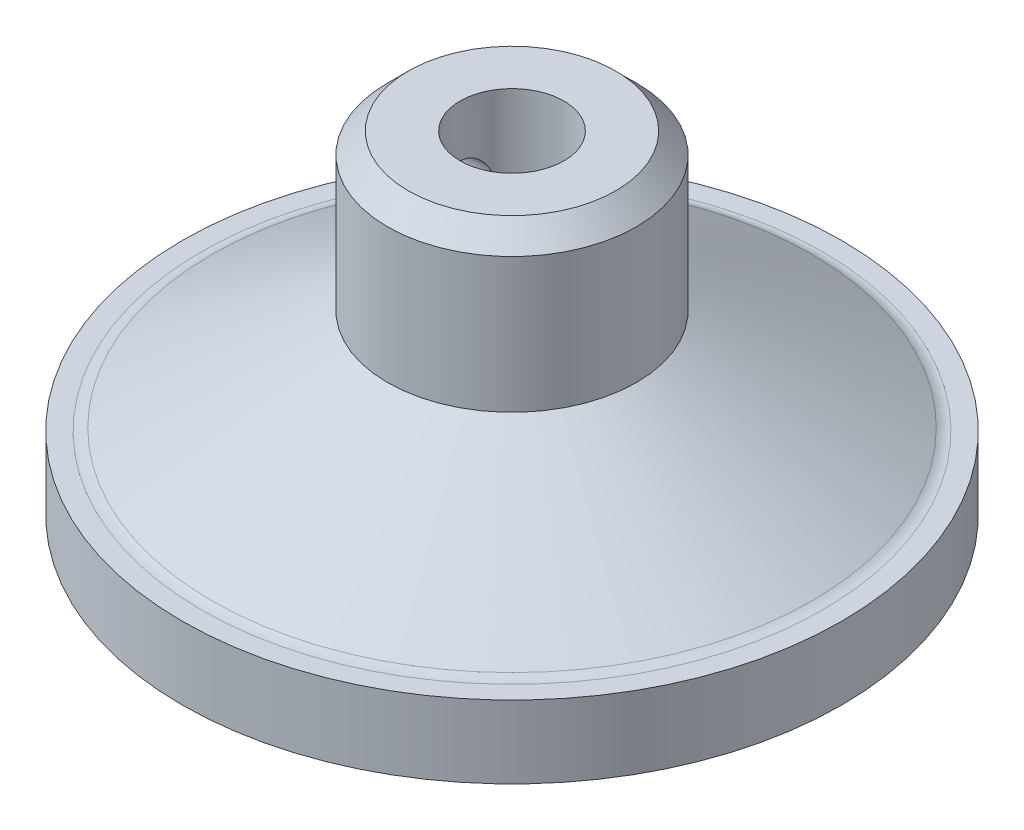
ISO-10303-21;
HEADER;
FILE_DESCRIPTION(('STEP AP214'),'2;1');
FILE_NAME('part.step','',(''),(''),'','','');
FILE_SCHEMA(('AUTOMOTIVE_DESIGN { 1 0 10303 214 1 1 1 1 }'));
ENDSEC;
DATA;
#1=APPLICATION_CONTEXT('core data for automotive mechanical design processes');
#2=APPLICATION_PROTOCOL_DEFINITION('international standard','automotive_design',2000,#1);
#3=PRODUCT_CONTEXT('',#1,'mechanical');
#4=PRODUCT('Part','Part','',(#3));
#5=PRODUCT_RELATED_PRODUCT_CATEGORY('part','',(#4));
#6=PRODUCT_DEFINITION_FORMATION('','',#4);
#7=PRODUCT_DEFINITION_CONTEXT('part definition',#1,'design');
#8=PRODUCT_DEFINITION('design','',#6,#7);
#9=PRODUCT_DEFINITION_SHAPE('','',#8);
#10=(LENGTH_UNIT() NAMED_UNIT(*) SI_UNIT(.MILLI.,.METRE.));
#11=(NAMED_UNIT(*) PLANE_ANGLE_UNIT() SI_UNIT($,.RADIAN.));
#12=(NAMED_UNIT(*) SI_UNIT($,.STERADIAN.) SOLID_ANGLE_UNIT());
#13=UNCERTAINTY_MEASURE_WITH_UNIT(LENGTH_MEASURE(1.E-05),#10,'distance_accuracy_value','');
#14=(GEOMETRIC_REPRESENTATION_CONTEXT(3) GLOBAL_UNCERTAINTY_ASSIGNED_CONTEXT((#13)) GLOBAL_UNIT_ASSIGNED_CONTEXT((#10,
#11,#12)) REPRESENTATION_CONTEXT('',''));
#15=CARTESIAN_POINT('',(0.,0.,0.));
#16=DIRECTION('',(0.,0.,1.));
#17=DIRECTION('',(1.,0.,0.));
#18=AXIS2_PLACEMENT_3D('',#15,#16,#17);
#19=CARTESIAN_POINT('',(0.,31.9758235435502,0.));
#20=DIRECTION('',(0.,1.,0.));
#21=DIRECTION('',(0.,0.,1.));
#22=AXIS2_PLACEMENT_3D('',#19,#20,#21);
#23=CYLINDRICAL_SURFACE('',#22,15.8878221735089);
#24=CARTESIAN_POINT('',(0.,-5.01591647054692,0.));
#25=DIRECTION('',(0.,1.,0.));
#26=DIRECTION('',(0.,0.,1.));
#27=AXIS2_PLACEMENT_3D('',#24,#25,#26);
#28=CIRCLE('',#27,15.8878221735089);
#29=CARTESIAN_POINT('',(0.,-5.01591647054692,15.8878221735089));
#30=VERTEX_POINT('',#29);
#31=EDGE_CURVE('E160',#30,#30,#28,.T.);
#32=ORIENTED_EDGE('',*,*,#31,.T.);
#33=EDGE_LOOP('',(#32));
#34=FACE_BOUND('',#33,.T.);
#35=CARTESIAN_POINT('',(0.,-1.51591647054691,0.));
#36=DIRECTION('',(0.,1.,0.));
#37=DIRECTION('',(0.,0.,1.));
#38=AXIS2_PLACEMENT_3D('',#35,#36,#37);
#39=CIRCLE('',#38,15.8878221735089);
#40=CARTESIAN_POINT('',(0.,-1.51591647054691,15.8878221735089));
#41=VERTEX_POINT('',#40);
#42=EDGE_CURVE('E146',#41,#41,#39,.T.);
#43=ORIENTED_EDGE('',*,*,#42,.F.);
#44=EDGE_LOOP('',(#43));
#45=FACE_BOUND('',#44,.T.);
#46=ADVANCED_FACE('F37',(#34,#45),#23,.T.);
#47=CARTESIAN_POINT('',(0.,-1.51591647054692,0.));
#48=DIRECTION('',(0.,1.,0.));
#49=DIRECTION('',(0.,0.,1.));
#50=AXIS2_PLACEMENT_3D('',#47,#48,#49);
#51=PLANE('',#50);
#52=CARTESIAN_POINT('',(0.,-1.51591647054692,0.));
#53=DIRECTION('',(0.,1.,0.));
#54=DIRECTION('',(0.,0.,1.));
#55=AXIS2_PLACEMENT_3D('',#52,#53,#54);
#56=CIRCLE('',#55,14.9557713659401);
#57=CARTESIAN_POINT('',(0.,-1.51591647054692,14.9557713659401));
#58=VERTEX_POINT('',#57);
#59=EDGE_CURVE('E49',#58,#58,#56,.F.);
#60=ORIENTED_EDGE('',*,*,#59,.T.);
#61=EDGE_LOOP('',(#60));
#62=FACE_BOUND('',#61,.T.);
#63=ORIENTED_EDGE('',*,*,#42,.T.);
#64=EDGE_LOOP('',(#63));
#65=FACE_BOUND('',#64,.T.);
#66=ADVANCED_FACE('F103',(#62,#65),#51,.T.);
#67=CARTESIAN_POINT('',(0.,3.5,0.));
#68=DIRECTION('',(0.,-1.,0.));
#69=DIRECTION('',(0.,0.,-1.));
#70=AXIS2_PLACEMENT_3D('',#67,#68,#69);
#71=CONICAL_SURFACE('',#70,6.,1.0471975511966);
#72=CARTESIAN_POINT('',(0.,-1.38194187433135,0.));
#73=DIRECTION('',(0.,-1.,0.));
#74=DIRECTION('',(0.,0.,-1.));
#75=AXIS2_PLACEMENT_3D('',#72,#73,#74);
#76=CIRCLE('',#75,14.4557713659401);
#77=CARTESIAN_POINT('',(0.,-1.38194187433135,-14.4557713659401));
#78=VERTEX_POINT('',#77);
#79=EDGE_CURVE('E53',#78,#78,#76,.F.);
#80=ORIENTED_EDGE('',*,*,#79,.T.);
#81=EDGE_LOOP('',(#80));
#82=FACE_BOUND('',#81,.T.);
#83=CARTESIAN_POINT('',(0.,3.5,0.));
#84=DIRECTION('',(0.,1.,0.));
#85=DIRECTION('',(0.,0.,1.));
#86=AXIS2_PLACEMENT_3D('',#83,#84,#85);
#87=CIRCLE('',#86,6.);
#88=CARTESIAN_POINT('',(0.,3.5,6.));
#89=VERTEX_POINT('',#88);
#90=EDGE_CURVE('E144',#89,#89,#87,.T.);
#91=ORIENTED_EDGE('',*,*,#90,.F.);
#92=EDGE_LOOP('',(#91));
#93=FACE_BOUND('',#92,.T.);
#94=ADVANCED_FACE('F99',(#82,#93),#71,.T.);
#95=CARTESIAN_POINT('',(0.,31.9758235435502,0.));
#96=DIRECTION('',(0.,1.,0.));
#97=DIRECTION('',(0.,0.,1.));
#98=AXIS2_PLACEMENT_3D('',#95,#96,#97);
#99=CYLINDRICAL_SURFACE('',#98,6.);
#100=CARTESIAN_POINT('',(-5.91483775658699,6.22071826363656,-1.00732038769462));
#101=CARTESIAN_POINT('',(-5.90543128244687,6.28797169082586,-1.06255721673369));
#102=CARTESIAN_POINT('',(-5.89622727626032,6.36014930812351,-1.11194509280329));
#103=CARTESIAN_POINT('',(-5.87931576917396,6.51190251680256,-1.19816011091402));
#104=CARTESIAN_POINT('',(-5.87161103842038,6.59149140810939,-1.23496409543613));
#105=CARTESIAN_POINT('',(-5.85855311445987,6.75600538295905,-1.29550008714941));
#106=CARTESIAN_POINT('',(-5.8532085231466,6.84094871753893,-1.31918435597301));
#107=CARTESIAN_POINT('',(-5.84550733148309,7.0135877790815,-1.35290234778387));
#108=CARTESIAN_POINT('',(-5.8431496060991,7.10128245696043,-1.36294121055756));
#109=CARTESIAN_POINT('',(-5.84164829843658,7.28099259962551,-1.3693652007367));
#110=CARTESIAN_POINT('',(-5.84264744553621,7.3730315580856,-1.36514396828114));
#111=CARTESIAN_POINT('',(-5.84806031937854,7.55511397802571,-1.34176422645991));
#112=CARTESIAN_POINT('',(-5.85247494332733,7.64515690877833,-1.32260179220374));
#113=CARTESIAN_POINT('',(-5.8642103788813,7.82097814949397,-1.26955658372632));
#114=CARTESIAN_POINT('',(-5.87154189574134,7.90673942571129,-1.23561954165773));
#115=CARTESIAN_POINT('',(-5.88821351349967,8.07101223937867,-1.15355452356076));
#116=CARTESIAN_POINT('',(-5.89755374955527,8.14952328848646,-1.10542559254556));
#117=CARTESIAN_POINT('',(-5.91675947634124,8.29433330369687,-0.997431067079696));
#118=CARTESIAN_POINT('',(-5.92660116071936,8.36092548659942,-0.937956064421894));
#119=CARTESIAN_POINT('',(-5.9457671407107,8.48191272146048,-0.80757277857249));
#120=CARTESIAN_POINT('',(-5.9550917758162,8.53631584980393,-0.736672119814294));
#121=CARTESIAN_POINT('',(-5.97110086326187,8.62577443399331,-0.592229184508382));
#122=CARTESIAN_POINT('',(-5.97794883133936,8.66214479760639,-0.519522334296942));
#123=CARTESIAN_POINT('',(-5.98915923947937,8.72040812340931,-0.368354061775815));
#124=CARTESIAN_POINT('',(-5.99352442965381,8.74231710844856,-0.289899115696935));
#125=CARTESIAN_POINT('',(-5.99878383296519,8.76855492751829,-0.139790161066972));
#126=CARTESIAN_POINT('',(-6.00003390907518,8.7746890996512,-0.0684608162744389));
#127=CARTESIAN_POINT('',(-5.99996473941875,8.77434945279604,0.0741565668801976));
#128=CARTESIAN_POINT('',(-5.99864636563279,8.76787991272764,0.145444611044841));
#129=CARTESIAN_POINT('',(-5.99374965828111,8.74342977399739,0.281699711330635));
#130=CARTESIAN_POINT('',(-5.99030452290538,8.72612681858913,0.346795376060325));
#131=CARTESIAN_POINT('',(-5.98163978874799,8.68145721533623,0.473295716776518));
#132=CARTESIAN_POINT('',(-5.97641995918308,8.65408925858955,0.534699911497293));
#133=CARTESIAN_POINT('',(-5.96444546834219,8.58895754809281,0.655148937892169));
#134=CARTESIAN_POINT('',(-5.95763252098112,8.55078297610113,0.713964814463623));
#135=CARTESIAN_POINT('',(-5.94326477324329,8.46602936082289,0.825075015368447));
#136=CARTESIAN_POINT('',(-5.93570968507338,8.41944705120766,0.877366791748897));
#137=CARTESIAN_POINT('',(-5.91969696852427,8.31389463550728,0.97987887461608));
#138=CARTESIAN_POINT('',(-5.91122908464167,8.25413297688861,1.02928222856886));
#139=CARTESIAN_POINT('',(-5.89499995296439,8.12775275981699,1.11849706997977));
#140=CARTESIAN_POINT('',(-5.88723902603517,8.06113111676981,1.15830421538346));
#141=CARTESIAN_POINT('',(-5.87238854278172,7.91537715422985,1.23150221770141));
#142=CARTESIAN_POINT('',(-5.86545576964515,7.83566618970967,1.26377583596079));
#143=CARTESIAN_POINT('',(-5.85406362893617,7.67202794642166,1.31553900889378));
#144=CARTESIAN_POINT('',(-5.84960496533133,7.5880994750314,1.33502492532301));
#145=CARTESIAN_POINT('',(-5.84346196331303,7.41319390130483,1.36167438773832));
#146=CARTESIAN_POINT('',(-5.84195380587374,7.32209053566734,1.36805648423665));
#147=CARTESIAN_POINT('',(-5.84241898623786,7.14004802802506,1.36606722652634));
#148=CARTESIAN_POINT('',(-5.84439281028675,7.04910891073218,1.35769381176681));
#149=CARTESIAN_POINT('',(-5.85164042847061,6.86865009327336,1.32611067110439));
#150=CARTESIAN_POINT('',(-5.85696014054536,6.77916821772333,1.3026944044854));
#151=CARTESIAN_POINT('',(-5.87029590269997,6.60556760653824,1.24121316011802));
#152=CARTESIAN_POINT('',(-5.87831233095778,6.521449625086,1.20314612768997));
#153=CARTESIAN_POINT('',(-5.895916249366,6.36244023863079,1.11364949569239));
#154=CARTESIAN_POINT('',(-5.90547897651684,6.28743161893195,1.06242403970802));
#155=CARTESIAN_POINT('',(-5.92504502332219,6.14794778175433,0.9472281434374));
#156=CARTESIAN_POINT('',(-5.93504821005079,6.08346941364879,0.883261528037201));
#157=CARTESIAN_POINT('',(-5.95346362496181,5.9718944691316,0.748703574776027));
#158=CARTESIAN_POINT('',(-5.96193773582487,5.92391585038323,0.678855355228878));
#159=CARTESIAN_POINT('',(-5.9769062092819,5.84214879382752,0.531105524715189));
#160=CARTESIAN_POINT('',(-5.98340281521655,5.80834425994975,0.453213174667956));
#161=CARTESIAN_POINT('',(-5.99282925286203,5.76013383527246,0.301742486861636));
#162=CARTESIAN_POINT('',(-5.99609387934914,5.74388502060342,0.228770506103541));
#163=CARTESIAN_POINT('',(-5.99990641356615,5.72495545508837,0.0810310347313678));
#164=CARTESIAN_POINT('',(-6.00045613716958,5.72226563523016,0.00626477786795835));
#165=CARTESIAN_POINT('',(-5.99884670170859,5.73022121316316,-0.135775253712967));
#166=CARTESIAN_POINT('',(-5.99692544307746,5.73969535007255,-0.203121027444966));
#167=CARTESIAN_POINT('',(-5.99099100463259,5.76952093006609,-0.335264748290149));
#168=CARTESIAN_POINT('',(-5.98697740914826,5.78987453452178,-0.400062186390661));
#169=CARTESIAN_POINT('',(-5.97722735475829,5.84078682623739,-0.526115404645001));
#170=CARTESIAN_POINT('',(-5.97147374623539,5.87144745186739,-0.587328336188923));
#171=CARTESIAN_POINT('',(-5.95882130341706,5.94169037071071,-0.704205646800116));
#172=CARTESIAN_POINT('',(-5.95192310140536,5.98126774252873,-0.759873062239022));
#173=CARTESIAN_POINT('',(-5.93989518893234,6.05407667419721,-0.847902845940636));
#174=CARTESIAN_POINT('',(-5.93490934552203,6.08526173665681,-0.882006576514368));
#175=CARTESIAN_POINT('',(-5.92487592256493,6.15074196768866,-0.947062420918866));
#176=CARTESIAN_POINT('',(-5.91982834409989,6.18503708183224,-0.978014589884651));
#177=CARTESIAN_POINT('',(-5.91483775658699,6.22071826363656,-1.00732038769462));
#178=B_SPLINE_CURVE_WITH_KNOTS('',3,(#100,#101,#102,#103,#104,#105,#106,#107,#108,#109,#110,
#111,#112,#113,#114,#115,#116,#117,#118,#119,#120,#121,#122,#123,#124,#125,#126,#127,#128,#129,
#130,#131,#132,#133,#134,#135,#136,#137,#138,#139,#140,#141,#142,#143,#144,#145,#146,#147,#148,
#149,#150,#151,#152,#153,#154,#155,#156,#157,#158,#159,#160,#161,#162,#163,#164,#165,#166,#167,
#168,#169,#170,#171,#172,#173,#174,#175,#176,#177),.UNSPECIFIED.,.T.,.F.,(4,2,2,2,2,2,2,2,2,2,2,
2,2,2,2,2,2,2,2,2,2,2,2,2,2,2,2,2,2,2,2,2,2,2,2,2,2,2,4),(0.,0.262436347529812,
0.525353076759218,0.789220293463884,1.05298809229006,1.32811039544879,1.6033049945899,
1.87951903929044,2.15575167496151,2.42378855151126,2.69164729993872,2.93499491007315,
3.17807244246412,3.39175918356619,3.60537339135056,3.80680298500644,4.00825878282086,
4.21874018382815,4.42930353161711,4.66234338592002,4.89548848808493,5.15318720780321,
5.41095921394384,5.68370323030379,5.95648533734413,6.23309524058098,6.50974395079712,
6.78233570784822,7.05484575606621,7.30888108663872,7.56262714858271,7.7858815721096,
8.00898665079044,8.21213588750412,8.41532549790892,8.62058689753882,8.82573528413763,
8.96497284079321,9.10420796113754),.UNSPECIFIED.);
#179=CARTESIAN_POINT('',(-5.91483775658699,6.22071826363656,-1.00732038769462));
#180=VERTEX_POINT('',#179);
#181=EDGE_CURVE('E10',#180,#180,#178,.T.);
#182=ORIENTED_EDGE('',*,*,#181,.T.);
#183=EDGE_LOOP('',(#182));
#184=FACE_BOUND('',#183,.T.);
#185=CARTESIAN_POINT('',(0.,9.99904522164386,0.));
#186=DIRECTION('',(0.,1.,0.));
#187=DIRECTION('',(0.,0.,1.));
#188=AXIS2_PLACEMENT_3D('',#185,#186,#187);
#189=CIRCLE('',#188,6.);
#190=CARTESIAN_POINT('',(0.,9.99904522164386,6.));
#191=VERTEX_POINT('',#190);
#192=EDGE_CURVE('E126',#191,#191,#189,.F.);
#193=ORIENTED_EDGE('',*,*,#192,.T.);
#194=EDGE_LOOP('',(#193));
#195=FACE_BOUND('',#194,.T.);
#196=ORIENTED_EDGE('',*,*,#90,.T.);
#197=EDGE_LOOP('',(#196));
#198=FACE_BOUND('',#197,.T.);
#199=ADVANCED_FACE('F60',(#184,#195,#198),#99,.T.);
#200=CARTESIAN_POINT('',(0.,10.9990452216439,0.));
#201=DIRECTION('',(0.,1.,0.));
#202=DIRECTION('',(0.,0.,1.));
#203=AXIS2_PLACEMENT_3D('',#200,#201,#202);
#204=PLANE('',#203);
#205=CARTESIAN_POINT('',(0.,10.9990452216439,0.));
#206=DIRECTION('',(0.,1.,0.));
#207=DIRECTION('',(0.,0.,1.));
#208=AXIS2_PLACEMENT_3D('',#205,#206,#207);
#209=CIRCLE('',#208,5.);
#210=CARTESIAN_POINT('',(0.,10.9990452216439,5.));
#211=VERTEX_POINT('',#210);
#212=EDGE_CURVE('E128',#211,#211,#209,.T.);
#213=ORIENTED_EDGE('',*,*,#212,.T.);
#214=EDGE_LOOP('',(#213));
#215=FACE_BOUND('',#214,.T.);
#216=CARTESIAN_POINT('',(0.,10.9990452216439,0.));
#217=DIRECTION('',(0.,1.,0.));
#218=DIRECTION('',(0.,0.,1.));
#219=AXIS2_PLACEMENT_3D('',#216,#217,#218);
#220=CIRCLE('',#219,2.5);
#221=CARTESIAN_POINT('',(0.,10.9990452216439,2.5));
#222=VERTEX_POINT('',#221);
#223=EDGE_CURVE('E147',#222,#222,#220,.T.);
#224=ORIENTED_EDGE('',*,*,#223,.F.);
#225=EDGE_LOOP('',(#224));
#226=FACE_BOUND('',#225,.T.);
#227=ADVANCED_FACE('F92',(#215,#226),#204,.T.);
#228=CARTESIAN_POINT('',(0.,31.9758235435502,0.));
#229=DIRECTION('',(0.,1.,0.));
#230=DIRECTION('',(0.,0.,1.));
#231=AXIS2_PLACEMENT_3D('',#228,#229,#230);
#232=CYLINDRICAL_SURFACE('',#231,2.5);
#233=CARTESIAN_POINT('',(-2.1650635094611,7.24952261082193,1.24999999999999));
#234=CARTESIAN_POINT('',(-2.16506918410575,7.31465737106599,1.24999545384316));
#235=CARTESIAN_POINT('',(-2.16804751484696,7.37987437522824,1.24487496341651));
#236=CARTESIAN_POINT('',(-2.17952958065066,7.50830669166837,1.22465401237256));
#237=CARTESIAN_POINT('',(-2.1880449256945,7.57151750462619,1.20953258069272));
#238=CARTESIAN_POINT('',(-2.20936683256749,7.69383719125185,1.17012493587476));
#239=CARTESIAN_POINT('',(-2.22215054341566,7.75296592641391,1.14588744061716));
#240=CARTESIAN_POINT('',(-2.25053331021073,7.86630286331783,1.08908440672046));
#241=CARTESIAN_POINT('',(-2.26613251845081,7.92051079865,1.05651841754471));
#242=CARTESIAN_POINT('',(-2.29996086321802,8.02740477151881,0.980833175663594));
#243=CARTESIAN_POINT('',(-2.31830079547442,8.07959653041386,0.937065045179708));
#244=CARTESIAN_POINT('',(-2.35464978482133,8.17628309633031,0.841567259518081));
#245=CARTESIAN_POINT('',(-2.37265867289063,8.22077406405133,0.789833657227862));
#246=CARTESIAN_POINT('',(-2.40776846191187,8.3037315497565,0.675611954268179));
#247=CARTESIAN_POINT('',(-2.42472633022716,8.34158982064634,0.612633986265715));
#248=CARTESIAN_POINT('',(-2.45438445124412,8.40594867737913,0.480196283249378));
#249=CARTESIAN_POINT('',(-2.46708738979677,8.43245643099339,0.410740672672692));
#250=CARTESIAN_POINT('',(-2.48600576555297,8.4714034374483,0.27255617990747));
#251=CARTESIAN_POINT('',(-2.49261850276115,8.48470951876634,0.204127238111021));
#252=CARTESIAN_POINT('',(-2.50009479807584,8.49973025916572,0.0657132858723103));
#253=CARTESIAN_POINT('',(-2.50096183480738,8.50145193181656,-0.00427075730467252));
#254=CARTESIAN_POINT('',(-2.49703727395563,8.49358926835899,-0.137290655529686));
#255=CARTESIAN_POINT('',(-2.49273119865201,8.4849750914204,-0.200401498970988));
#256=CARTESIAN_POINT('',(-2.47967806574685,8.4584215559411,-0.324142214897901));
#257=CARTESIAN_POINT('',(-2.47093067582992,8.44048149960165,-0.384771901367405));
#258=CARTESIAN_POINT('',(-2.44964479109568,8.39566940320966,-0.50288673946194));
#259=CARTESIAN_POINT('',(-2.43705551911499,8.36867721935684,-0.56031677939397));
#260=CARTESIAN_POINT('',(-2.40922057483359,8.30669334057006,-0.669971001891657));
#261=CARTESIAN_POINT('',(-2.39397395196856,8.27169878169399,-0.722193311048304));
#262=CARTESIAN_POINT('',(-2.36055492999037,8.19090342140566,-0.825217076122739));
#263=CARTESIAN_POINT('',(-2.34224219997719,8.14439382541441,-0.875417593786696));
#264=CARTESIAN_POINT('',(-2.30567925733515,8.04378545465921,-0.96763046287222));
#265=CARTESIAN_POINT('',(-2.28742910332037,7.98968089547935,-1.00963651446778));
#266=CARTESIAN_POINT('',(-2.25180195115606,7.87121237029182,-1.08688166830276));
#267=CARTESIAN_POINT('',(-2.23455399988385,7.80641508200416,-1.12152164372256));
#268=CARTESIAN_POINT('',(-2.20469312848221,7.67085052162318,-1.17914889125153));
#269=CARTESIAN_POINT('',(-2.19207537557585,7.60008956954998,-1.2021483227636));
#270=CARTESIAN_POINT('',(-2.17430794771294,7.46050447171844,-1.23397526378129));
#271=CARTESIAN_POINT('',(-2.16864569810621,7.39197121201749,-1.24378140264996));
#272=CARTESIAN_POINT('',(-2.16397399202013,7.25402093392625,-1.25189618326428));
#273=CARTESIAN_POINT('',(-2.1649598361164,7.1846045744222,-1.25021294664377));
#274=CARTESIAN_POINT('',(-2.17292920675732,7.05495521259852,-1.23629505417995));
#275=CARTESIAN_POINT('',(-2.17924484383318,6.99454829693702,-1.22523477089058));
#276=CARTESIAN_POINT('',(-2.19617526939177,6.87656287798323,-1.19462035579054));
#277=CARTESIAN_POINT('',(-2.20679145006293,6.81898529738867,-1.17506347327951));
#278=CARTESIAN_POINT('',(-2.23170277599571,6.70525844719356,-1.1270594857561));
#279=CARTESIAN_POINT('',(-2.2461455405383,6.64929883975499,-1.0982425796159));
#280=CARTESIAN_POINT('',(-2.27695149371563,6.54268602139819,-1.03285883001975));
#281=CARTESIAN_POINT('',(-2.29331566693935,6.49203555643033,-0.996288005415263));
#282=CARTESIAN_POINT('',(-2.32859998070421,6.3907991514175,-0.91104645899856));
#283=CARTESIAN_POINT('',(-2.34758228942862,6.34102617242486,-0.861431590393702));
#284=CARTESIAN_POINT('',(-2.38417793722366,6.25025731332995,-0.754255619247855));
#285=CARTESIAN_POINT('',(-2.40179081259637,6.20926439803376,-0.696691843319178));
#286=CARTESIAN_POINT('',(-2.43426702113697,6.13630545338431,-0.573169203198441));
#287=CARTESIAN_POINT('',(-2.44904552090037,6.1046062130583,-0.507028871967636));
#288=CARTESIAN_POINT('',(-2.47354193699127,6.0531002310002,-0.369402955801348));
#289=CARTESIAN_POINT('',(-2.48326429595467,6.03328304661406,-0.297922126740216));
#290=CARTESIAN_POINT('',(-2.49584385227354,6.00781190560361,-0.158724602913018));
#291=CARTESIAN_POINT('',(-2.49924909885239,6.0010252659768,-0.0912643048130679));
#292=CARTESIAN_POINT('',(-2.50052662968914,5.99846852900394,0.0439074824390071));
#293=CARTESIAN_POINT('',(-2.49840085083613,6.00269457516748,0.111618875368861));
#294=CARTESIAN_POINT('',(-2.48917461047404,6.02129311931647,0.240672490396436));
#295=CARTESIAN_POINT('',(-2.48241118334988,6.03497867239403,0.302140397264082));
#296=CARTESIAN_POINT('',(-2.46490117079279,6.07118135995065,0.421807440229523));
#297=CARTESIAN_POINT('',(-2.45415401415995,6.09369976093875,0.480006106194387));
#298=CARTESIAN_POINT('',(-2.4290741343515,6.14793142602941,0.594279257806106));
#299=CARTESIAN_POINT('',(-2.41460771498499,6.17999676483174,0.650156428375057));
#300=CARTESIAN_POINT('',(-2.38360166427283,6.25197002439575,0.75596830226753));
#301=CARTESIAN_POINT('',(-2.36706108197951,6.29188154721653,0.805900259268633));
#302=CARTESIAN_POINT('',(-2.33160762783285,6.38301903460032,0.903642505196112));
#303=CARTESIAN_POINT('',(-2.31262248764623,6.43497572016843,0.950747105674087));
#304=CARTESIAN_POINT('',(-2.27578845203566,6.54633601223415,1.03582910924334));
#305=CARTESIAN_POINT('',(-2.25794057202332,6.60574613690654,1.07379843751257));
#306=CARTESIAN_POINT('',(-2.22499506631146,6.73281841904813,1.14053884973206));
#307=CARTESIAN_POINT('',(-2.21000217820338,6.80068202473286,1.16898133245117));
#308=CARTESIAN_POINT('',(-2.1858269541044,6.94118811624666,1.21359838688301));
#309=CARTESIAN_POINT('',(-2.17662520184628,7.01381372196279,1.22981398896918));
#310=CARTESIAN_POINT('',(-2.16911590752239,7.11427930538693,1.24295875983051));
#311=CARTESIAN_POINT('',(-2.1676016125644,7.14123247881929,1.24559513120481));
#312=CARTESIAN_POINT('',(-2.16557419859688,7.19529321167474,1.24911675636245));
#313=CARTESIAN_POINT('',(-2.16506114656387,7.22240078130427,1.25000189299983));
#314=CARTESIAN_POINT('',(-2.1650635094611,7.24952261082193,1.24999999999999));
#315=B_SPLINE_CURVE_WITH_KNOTS('',3,(#233,#234,#235,#236,#237,#238,#239,#240,#241,#242,#243,
#244,#245,#246,#247,#248,#249,#250,#251,#252,#253,#254,#255,#256,#257,#258,#259,#260,#261,#262,
#263,#264,#265,#266,#267,#268,#269,#270,#271,#272,#273,#274,#275,#276,#277,#278,#279,#280,#281,
#282,#283,#284,#285,#286,#287,#288,#289,#290,#291,#292,#293,#294,#295,#296,#297,#298,#299,#300,
#301,#302,#303,#304,#305,#306,#307,#308,#309,#310,#311,#312,#313,#314),.UNSPECIFIED.,.T.,.F.,(4,
2,2,2,2,2,2,2,2,2,2,2,2,2,2,2,2,2,2,2,2,2,2,2,2,2,2,2,2,2,2,2,2,2,2,2,2,2,2,2,4),(0.,
0.195290153243394,0.390991116031004,0.585660744898605,0.780340906806433,0.991077890622788,
1.20191963855463,1.42697365298454,1.65188533704863,1.86079356209918,2.06957529607549,
2.26020121855672,2.45084140646818,2.64411918413932,2.83746624187838,3.04908989321112,
3.26087560307397,3.48611052161809,3.71110967764629,3.91827863567763,4.12530116485464,
4.3096772928003,4.49411315545077,4.68709120507607,4.88016857775057,5.09758429475764,
5.3150733122275,5.53830226766204,5.76133474760961,5.96390337986855,6.16640108492461,
6.35555531089362,6.54473666890013,6.74200938399336,6.93937287625895,7.15637802312581,
7.37357428556439,7.59763436298252,7.82093916253446,7.90225168981632,7.98356965618171),.UNSPECIFIED.);
#316=CARTESIAN_POINT('',(-2.1650635094611,7.24952261082193,1.24999999999999));
#317=VERTEX_POINT('',#316);
#318=EDGE_CURVE('E41',#317,#317,#315,.T.);
#319=ORIENTED_EDGE('',*,*,#318,.T.);
#320=EDGE_LOOP('',(#319));
#321=FACE_BOUND('',#320,.T.);
#322=CARTESIAN_POINT('',(0.,3.5,0.));
#323=DIRECTION('',(0.,1.,0.));
#324=DIRECTION('',(0.,0.,1.));
#325=AXIS2_PLACEMENT_3D('',#322,#323,#324);
#326=CIRCLE('',#325,2.5);
#327=CARTESIAN_POINT('',(0.,3.5,2.5));
#328=VERTEX_POINT('',#327);
#329=EDGE_CURVE('E152',#328,#328,#326,.T.);
#330=ORIENTED_EDGE('',*,*,#329,.F.);
#331=EDGE_LOOP('',(#330));
#332=FACE_BOUND('',#331,.T.);
#333=ORIENTED_EDGE('',*,*,#223,.T.);
#334=EDGE_LOOP('',(#333));
#335=FACE_BOUND('',#334,.T.);
#336=ADVANCED_FACE('F88',(#321,#332,#335),#232,.F.);
#337=CARTESIAN_POINT('',(0.,3.5,0.));
#338=DIRECTION('',(0.,1.,0.));
#339=DIRECTION('',(0.,0.,1.));
#340=AXIS2_PLACEMENT_3D('',#337,#338,#339);
#341=PLANE('',#340);
#342=ORIENTED_EDGE('',*,*,#329,.T.);
#343=EDGE_LOOP('',(#342));
#344=FACE_BOUND('',#343,.T.);
#345=ADVANCED_FACE('F85',(#344),#341,.T.);
#346=CARTESIAN_POINT('',(0.,0.,0.));
#347=DIRECTION('',(0.,-1.,0.));
#348=DIRECTION('',(0.,0.,-1.));
#349=AXIS2_PLACEMENT_3D('',#346,#347,#348);
#350=PLANE('',#349);
#351=CARTESIAN_POINT('',(0.,0.,0.));
#352=DIRECTION('',(0.,1.,0.));
#353=DIRECTION('',(0.,0.,1.));
#354=AXIS2_PLACEMENT_3D('',#351,#352,#353);
#355=CIRCLE('',#354,5.06217782649108);
#356=CARTESIAN_POINT('',(0.,0.,5.06217782649108));
#357=VERTEX_POINT('',#356);
#358=EDGE_CURVE('E161',#357,#357,#355,.T.);
#359=ORIENTED_EDGE('',*,*,#358,.F.);
#360=EDGE_LOOP('',(#359));
#361=FACE_BOUND('',#360,.T.);
#362=ADVANCED_FACE('F81',(#361),#350,.T.);
#363=CARTESIAN_POINT('',(0.,0.,0.));
#364=DIRECTION('',(0.,-1.,0.));
#365=DIRECTION('',(0.,0.,-1.));
#366=AXIS2_PLACEMENT_3D('',#363,#364,#365);
#367=CONICAL_SURFACE('',#366,5.06217782649108,1.0471975511966);
#368=CARTESIAN_POINT('',(0.,-4.61399268190023,0.));
#369=DIRECTION('',(0.,-1.,0.));
#370=DIRECTION('',(0.,0.,-1.));
#371=AXIS2_PLACEMENT_3D('',#368,#369,#370);
#372=CIRCLE('',#371,13.0538475772934);
#373=CARTESIAN_POINT('',(0.,-4.61399268190023,-13.0538475772934));
#374=VERTEX_POINT('',#373);
#375=EDGE_CURVE('E129',#374,#374,#372,.T.);
#376=ORIENTED_EDGE('',*,*,#375,.T.);
#377=EDGE_LOOP('',(#376));
#378=FACE_BOUND('',#377,.T.);
#379=ORIENTED_EDGE('',*,*,#358,.T.);
#380=EDGE_LOOP('',(#379));
#381=FACE_BOUND('',#380,.T.);
#382=ADVANCED_FACE('F77',(#378,#381),#367,.F.);
#383=CARTESIAN_POINT('',(0.,-5.01591647054691,0.));
#384=DIRECTION('',(0.,-1.,0.));
#385=DIRECTION('',(0.,0.,-1.));
#386=AXIS2_PLACEMENT_3D('',#383,#384,#385);
#387=PLANE('',#386);
#388=CARTESIAN_POINT('',(0.,-5.01591647054691,0.));
#389=DIRECTION('',(0.,-1.,0.));
#390=DIRECTION('',(0.,0.,-1.));
#391=AXIS2_PLACEMENT_3D('',#388,#389,#390);
#392=CIRCLE('',#391,14.5538475772934);
#393=CARTESIAN_POINT('',(0.,-5.01591647054691,-14.5538475772934));
#394=VERTEX_POINT('',#393);
#395=EDGE_CURVE('E133',#394,#394,#392,.F.);
#396=ORIENTED_EDGE('',*,*,#395,.T.);
#397=EDGE_LOOP('',(#396));
#398=FACE_BOUND('',#397,.T.);
#399=ORIENTED_EDGE('',*,*,#31,.F.);
#400=EDGE_LOOP('',(#399));
#401=FACE_BOUND('',#400,.T.);
#402=ADVANCED_FACE('F73',(#398,#401),#387,.T.);
#403=CARTESIAN_POINT('',(0.,-2.01591647054691,0.));
#404=DIRECTION('',(0.,-1.,0.));
#405=DIRECTION('',(0.,0.,-1.));
#406=AXIS2_PLACEMENT_3D('',#403,#404,#405);
#407=TOROIDAL_SURFACE('',#406,14.5538475772934,3.);
#408=ORIENTED_EDGE('',*,*,#375,.F.);
#409=EDGE_LOOP('',(#408));
#410=FACE_BOUND('',#409,.T.);
#411=ORIENTED_EDGE('',*,*,#395,.F.);
#412=EDGE_LOOP('',(#411));
#413=FACE_BOUND('',#412,.T.);
#414=ADVANCED_FACE('F76',(#410,#413),#407,.T.);
#415=CARTESIAN_POINT('',(0.,10.9990452216439,0.));
#416=DIRECTION('',(0.,-1.,0.));
#417=DIRECTION('',(0.,0.,-1.));
#418=AXIS2_PLACEMENT_3D('',#415,#416,#417);
#419=CONICAL_SURFACE('',#418,5.,0.785398163397445);
#420=ORIENTED_EDGE('',*,*,#192,.F.);
#421=EDGE_LOOP('',(#420));
#422=FACE_BOUND('',#421,.T.);
#423=ORIENTED_EDGE('',*,*,#212,.F.);
#424=EDGE_LOOP('',(#423));
#425=FACE_BOUND('',#424,.T.);
#426=ADVANCED_FACE('F115',(#422,#425),#419,.T.);
#427=CARTESIAN_POINT('',(0.,-0.515916470546917,0.));
#428=DIRECTION('',(0.,1.,0.));
#429=DIRECTION('',(0.,0.,1.));
#430=AXIS2_PLACEMENT_3D('',#427,#428,#429);
#431=TOROIDAL_SURFACE('',#430,14.9557713659401,1.);
#432=ORIENTED_EDGE('',*,*,#59,.F.);
#433=EDGE_LOOP('',(#432));
#434=FACE_BOUND('',#433,.T.);
#435=ORIENTED_EDGE('',*,*,#79,.F.);
#436=EDGE_LOOP('',(#435));
#437=FACE_BOUND('',#436,.T.);
#438=ADVANCED_FACE('F39',(#434,#437),#431,.F.);
#439=CARTESIAN_POINT('',(-6.,7.24952261082193,0.));
#440=DIRECTION('',(-1.,0.,0.));
#441=DIRECTION('',(0.,0.,1.));
#442=AXIS2_PLACEMENT_3D('',#439,#440,#441);
#443=CYLINDRICAL_SURFACE('',#442,1.24999999999999);
#444=CARTESIAN_POINT('',(-5.725,7.24952261082193,0.));
#445=DIRECTION('',(-1.,0.,0.));
#446=DIRECTION('',(0.,0.,1.));
#447=AXIS2_PLACEMENT_3D('',#444,#445,#446);
#448=CIRCLE('',#447,1.24999999999999);
#449=CARTESIAN_POINT('',(-5.725,7.24952261082193,1.24999999999999));
#450=VERTEX_POINT('',#449);
#451=EDGE_CURVE('E166',#450,#450,#448,.T.);
#452=ORIENTED_EDGE('',*,*,#451,.T.);
#453=EDGE_LOOP('',(#452));
#454=FACE_BOUND('',#453,.T.);
#455=ORIENTED_EDGE('',*,*,#318,.F.);
#456=EDGE_LOOP('',(#455));
#457=FACE_BOUND('',#456,.T.);
#458=ADVANCED_FACE('F67',(#454,#457),#443,.F.);
#459=CARTESIAN_POINT('',(-6.,7.24952261082193,0.));
#460=DIRECTION('',(-1.,0.,0.));
#461=DIRECTION('',(0.,0.,1.));
#462=AXIS2_PLACEMENT_3D('',#459,#460,#461);
#463=CONICAL_SURFACE('',#462,1.525,0.78539816339747);
#464=ORIENTED_EDGE('',*,*,#451,.F.);
#465=EDGE_LOOP('',(#464));
#466=FACE_BOUND('',#465,.T.);
#467=ORIENTED_EDGE('',*,*,#181,.F.);
#468=EDGE_LOOP('',(#467));
#469=FACE_BOUND('',#468,.T.);
#470=ADVANCED_FACE('F64',(#466,#469),#463,.F.);
#471=CLOSED_SHELL('',(#46,#66,#94,#199,#227,#336,#345,#362,#382,#402,#414,#426,#438,#458,#470));
#472=MANIFOLD_SOLID_BREP('B2',#471);
#473=ADVANCED_BREP_SHAPE_REPRESENTATION('',(#18,#472),#14);
#474=SHAPE_DEFINITION_REPRESENTATION(#9,#473);
ENDSEC;
END-ISO-10303-21;
